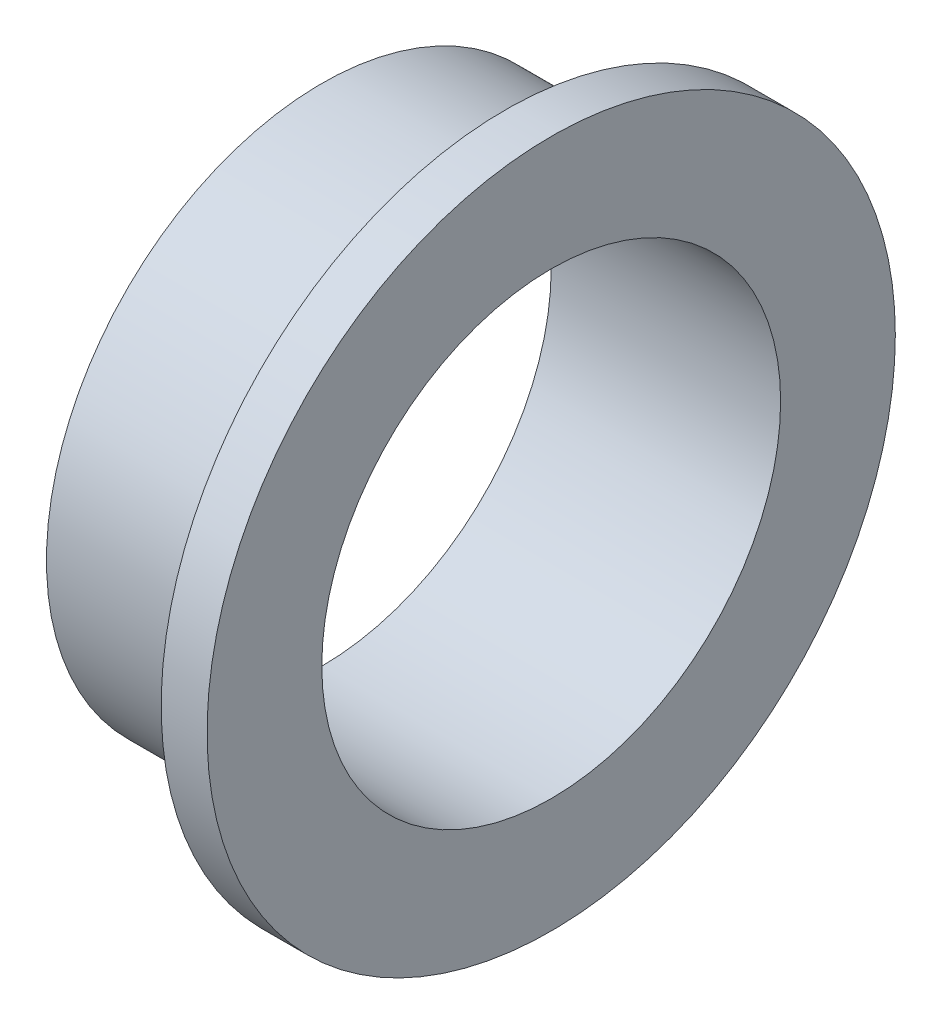
ISO-10303-21;
HEADER;
FILE_DESCRIPTION(('STEP AP214'),'2;1');
FILE_NAME('part.step','',(''),(''),'','','');
FILE_SCHEMA(('AUTOMOTIVE_DESIGN { 1 0 10303 214 1 1 1 1 }'));
ENDSEC;
DATA;
#1=APPLICATION_CONTEXT('core data for automotive mechanical design processes');
#2=APPLICATION_PROTOCOL_DEFINITION('international standard','automotive_design',2000,#1);
#3=PRODUCT_CONTEXT('',#1,'mechanical');
#4=PRODUCT('Part','Part','',(#3));
#5=PRODUCT_RELATED_PRODUCT_CATEGORY('part','',(#4));
#6=PRODUCT_DEFINITION_FORMATION('','',#4);
#7=PRODUCT_DEFINITION_CONTEXT('part definition',#1,'design');
#8=PRODUCT_DEFINITION('design','',#6,#7);
#9=PRODUCT_DEFINITION_SHAPE('','',#8);
#10=(LENGTH_UNIT() NAMED_UNIT(*) SI_UNIT(.MILLI.,.METRE.));
#11=(NAMED_UNIT(*) PLANE_ANGLE_UNIT() SI_UNIT($,.RADIAN.));
#12=(NAMED_UNIT(*) SI_UNIT($,.STERADIAN.) SOLID_ANGLE_UNIT());
#13=UNCERTAINTY_MEASURE_WITH_UNIT(LENGTH_MEASURE(1.E-05),#10,'distance_accuracy_value','');
#14=(GEOMETRIC_REPRESENTATION_CONTEXT(3) GLOBAL_UNCERTAINTY_ASSIGNED_CONTEXT((#13)) GLOBAL_UNIT_ASSIGNED_CONTEXT((#10,
#11,#12)) REPRESENTATION_CONTEXT('',''));
#15=CARTESIAN_POINT('',(0.,0.,0.));
#16=DIRECTION('',(0.,0.,1.));
#17=DIRECTION('',(1.,0.,0.));
#18=AXIS2_PLACEMENT_3D('',#15,#16,#17);
#19=CARTESIAN_POINT('',(-1.,0.,0.));
#20=DIRECTION('',(1.,0.,0.));
#21=DIRECTION('',(0.,0.,-1.));
#22=AXIS2_PLACEMENT_3D('',#19,#20,#21);
#23=CYLINDRICAL_SURFACE('',#22,7.5);
#24=CARTESIAN_POINT('',(-1.,0.,0.));
#25=DIRECTION('',(1.,0.,0.));
#26=DIRECTION('',(0.,0.,-1.));
#27=AXIS2_PLACEMENT_3D('',#24,#25,#26);
#28=CIRCLE('',#27,7.5);
#29=CARTESIAN_POINT('',(-1.,0.,-7.5));
#30=VERTEX_POINT('',#29);
#31=EDGE_CURVE('E10',#30,#30,#28,.T.);
#32=ORIENTED_EDGE('',*,*,#31,.T.);
#33=EDGE_LOOP('',(#32));
#34=FACE_BOUND('',#33,.T.);
#35=CARTESIAN_POINT('',(0.,0.,0.));
#36=DIRECTION('',(1.,0.,0.));
#37=DIRECTION('',(0.,0.,-1.));
#38=AXIS2_PLACEMENT_3D('',#35,#36,#37);
#39=CIRCLE('',#38,7.5);
#40=CARTESIAN_POINT('',(0.,0.,-7.5));
#41=VERTEX_POINT('',#40);
#42=EDGE_CURVE('E45',#41,#41,#39,.T.);
#43=ORIENTED_EDGE('',*,*,#42,.F.);
#44=EDGE_LOOP('',(#43));
#45=FACE_BOUND('',#44,.T.);
#46=ADVANCED_FACE('F39',(#34,#45),#23,.T.);
#47=CARTESIAN_POINT('',(-1.,0.,0.));
#48=DIRECTION('',(1.,0.,0.));
#49=DIRECTION('',(0.,0.,-1.));
#50=AXIS2_PLACEMENT_3D('',#47,#48,#49);
#51=PLANE('',#50);
#52=CARTESIAN_POINT('',(-1.,0.,0.));
#53=DIRECTION('',(1.,0.,0.));
#54=DIRECTION('',(0.,0.,-1.));
#55=AXIS2_PLACEMENT_3D('',#52,#53,#54);
#56=CIRCLE('',#55,6.);
#57=CARTESIAN_POINT('',(-1.,0.,-6.));
#58=VERTEX_POINT('',#57);
#59=EDGE_CURVE('E47',#58,#58,#56,.T.);
#60=ORIENTED_EDGE('',*,*,#59,.T.);
#61=EDGE_LOOP('',(#60));
#62=FACE_BOUND('',#61,.T.);
#63=ORIENTED_EDGE('',*,*,#31,.F.);
#64=EDGE_LOOP('',(#63));
#65=FACE_BOUND('',#64,.T.);
#66=ADVANCED_FACE('F73',(#62,#65),#51,.F.);
#67=CARTESIAN_POINT('',(0.,0.,0.));
#68=DIRECTION('',(1.,0.,0.));
#69=DIRECTION('',(0.,0.,-1.));
#70=AXIS2_PLACEMENT_3D('',#67,#68,#69);
#71=PLANE('',#70);
#72=ORIENTED_EDGE('',*,*,#42,.T.);
#73=EDGE_LOOP('',(#72));
#74=FACE_BOUND('',#73,.T.);
#75=CARTESIAN_POINT('',(0.,0.,0.));
#76=DIRECTION('',(1.,0.,0.));
#77=DIRECTION('',(0.,0.,-1.));
#78=AXIS2_PLACEMENT_3D('',#75,#76,#77);
#79=CIRCLE('',#78,5.);
#80=CARTESIAN_POINT('',(0.,0.,-5.));
#81=VERTEX_POINT('',#80);
#82=EDGE_CURVE('E53',#81,#81,#79,.T.);
#83=ORIENTED_EDGE('',*,*,#82,.F.);
#84=EDGE_LOOP('',(#83));
#85=FACE_BOUND('',#84,.T.);
#86=ADVANCED_FACE('F71',(#74,#85),#71,.T.);
#87=CARTESIAN_POINT('',(-5.,0.,0.));
#88=DIRECTION('',(1.,0.,0.));
#89=DIRECTION('',(0.,0.,-1.));
#90=AXIS2_PLACEMENT_3D('',#87,#88,#89);
#91=CYLINDRICAL_SURFACE('',#90,6.);
#92=CARTESIAN_POINT('',(-5.,0.,0.));
#93=DIRECTION('',(1.,0.,0.));
#94=DIRECTION('',(0.,0.,-1.));
#95=AXIS2_PLACEMENT_3D('',#92,#93,#94);
#96=CIRCLE('',#95,6.);
#97=CARTESIAN_POINT('',(-5.,0.,-6.));
#98=VERTEX_POINT('',#97);
#99=EDGE_CURVE('E52',#98,#98,#96,.T.);
#100=ORIENTED_EDGE('',*,*,#99,.T.);
#101=EDGE_LOOP('',(#100));
#102=FACE_BOUND('',#101,.T.);
#103=ORIENTED_EDGE('',*,*,#59,.F.);
#104=EDGE_LOOP('',(#103));
#105=FACE_BOUND('',#104,.T.);
#106=ADVANCED_FACE('F68',(#102,#105),#91,.T.);
#107=CARTESIAN_POINT('',(-5.,0.,0.));
#108=DIRECTION('',(1.,0.,0.));
#109=DIRECTION('',(0.,0.,-1.));
#110=AXIS2_PLACEMENT_3D('',#107,#108,#109);
#111=CYLINDRICAL_SURFACE('',#110,5.);
#112=CARTESIAN_POINT('',(-5.,0.,0.));
#113=DIRECTION('',(1.,0.,0.));
#114=DIRECTION('',(0.,0.,-1.));
#115=AXIS2_PLACEMENT_3D('',#112,#113,#114);
#116=CIRCLE('',#115,5.);
#117=CARTESIAN_POINT('',(-5.,0.,-5.));
#118=VERTEX_POINT('',#117);
#119=EDGE_CURVE('E60',#118,#118,#116,.T.);
#120=ORIENTED_EDGE('',*,*,#119,.F.);
#121=EDGE_LOOP('',(#120));
#122=FACE_BOUND('',#121,.T.);
#123=ORIENTED_EDGE('',*,*,#82,.T.);
#124=EDGE_LOOP('',(#123));
#125=FACE_BOUND('',#124,.T.);
#126=ADVANCED_FACE('F66',(#122,#125),#111,.F.);
#127=CARTESIAN_POINT('',(-5.,0.,0.));
#128=DIRECTION('',(1.,0.,0.));
#129=DIRECTION('',(0.,0.,-1.));
#130=AXIS2_PLACEMENT_3D('',#127,#128,#129);
#131=PLANE('',#130);
#132=ORIENTED_EDGE('',*,*,#119,.T.);
#133=EDGE_LOOP('',(#132));
#134=FACE_BOUND('',#133,.T.);
#135=ORIENTED_EDGE('',*,*,#99,.F.);
#136=EDGE_LOOP('',(#135));
#137=FACE_BOUND('',#136,.T.);
#138=ADVANCED_FACE('F64',(#134,#137),#131,.F.);
#139=CLOSED_SHELL('',(#46,#66,#86,#106,#126,#138));
#140=MANIFOLD_SOLID_BREP('B2',#139);
#141=ADVANCED_BREP_SHAPE_REPRESENTATION('',(#18,#140),#14);
#142=SHAPE_DEFINITION_REPRESENTATION(#9,#141);
ENDSEC;
END-ISO-10303-21;
